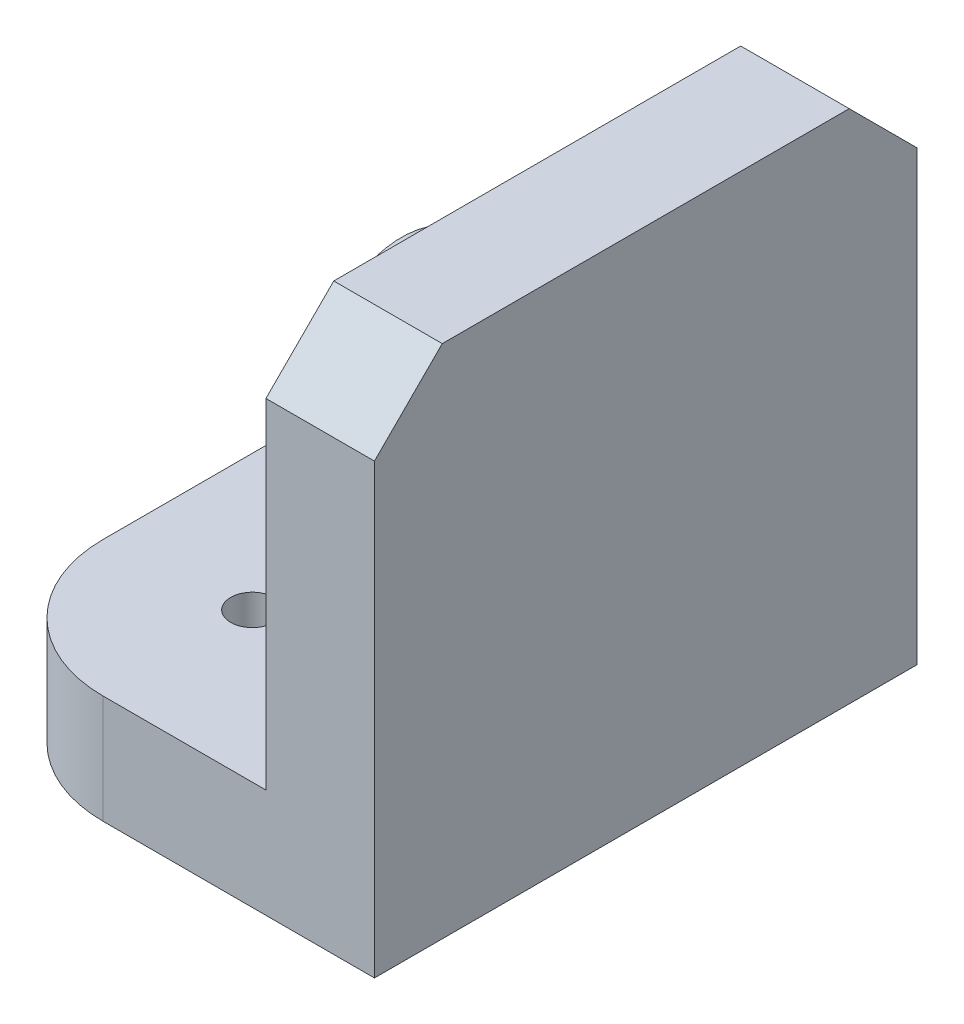
ISO-10303-21;
HEADER;
FILE_DESCRIPTION(('STEP AP214'),'2;1');
FILE_NAME('part.step','',(''),(''),'','','');
FILE_SCHEMA(('AUTOMOTIVE_DESIGN { 1 0 10303 214 1 1 1 1 }'));
ENDSEC;
DATA;
#1=APPLICATION_CONTEXT('core data for automotive mechanical design processes');
#2=APPLICATION_PROTOCOL_DEFINITION('international standard','automotive_design',2000,#1);
#3=PRODUCT_CONTEXT('',#1,'mechanical');
#4=PRODUCT('Part','Part','',(#3));
#5=PRODUCT_RELATED_PRODUCT_CATEGORY('part','',(#4));
#6=PRODUCT_DEFINITION_FORMATION('','',#4);
#7=PRODUCT_DEFINITION_CONTEXT('part definition',#1,'design');
#8=PRODUCT_DEFINITION('design','',#6,#7);
#9=PRODUCT_DEFINITION_SHAPE('','',#8);
#10=(LENGTH_UNIT() NAMED_UNIT(*) SI_UNIT(.MILLI.,.METRE.));
#11=(NAMED_UNIT(*) PLANE_ANGLE_UNIT() SI_UNIT($,.RADIAN.));
#12=(NAMED_UNIT(*) SI_UNIT($,.STERADIAN.) SOLID_ANGLE_UNIT());
#13=UNCERTAINTY_MEASURE_WITH_UNIT(LENGTH_MEASURE(1.E-05),#10,'distance_accuracy_value','');
#14=(GEOMETRIC_REPRESENTATION_CONTEXT(3) GLOBAL_UNCERTAINTY_ASSIGNED_CONTEXT((#13)) GLOBAL_UNIT_ASSIGNED_CONTEXT((#10,
#11,#12)) REPRESENTATION_CONTEXT('',''));
#15=CARTESIAN_POINT('',(0.,0.,0.));
#16=DIRECTION('',(0.,0.,1.));
#17=DIRECTION('',(1.,0.,0.));
#18=AXIS2_PLACEMENT_3D('',#15,#16,#17);
#19=CARTESIAN_POINT('',(0.,-3.99999999999525,20.));
#20=DIRECTION('',(0.,-1.,0.));
#21=DIRECTION('',(1.,0.,0.));
#22=AXIS2_PLACEMENT_3D('',#19,#20,#21);
#23=PLANE('',#22);
#24=CARTESIAN_POINT('',(-16.,-3.99999999999527,8.99999999999999));
#25=DIRECTION('',(0.,-1.,0.));
#26=DIRECTION('',(1.,0.,0.));
#27=AXIS2_PLACEMENT_3D('',#24,#25,#26);
#28=CIRCLE('',#27,1.6);
#29=CARTESIAN_POINT('',(-14.4,-3.99999999999527,8.99999999999999));
#30=VERTEX_POINT('',#29);
#31=EDGE_CURVE('E199',#30,#30,#28,.T.);
#32=ORIENTED_EDGE('',*,*,#31,.F.);
#33=EDGE_LOOP('',(#32));
#34=FACE_BOUND('',#33,.T.);
#35=CARTESIAN_POINT('',(-16.,-3.99999999999527,-8.99999999999999));
#36=DIRECTION('',(0.,-1.,0.));
#37=DIRECTION('',(-1.,0.,0.));
#38=AXIS2_PLACEMENT_3D('',#35,#36,#37);
#39=CIRCLE('',#38,1.6);
#40=CARTESIAN_POINT('',(-17.6,-3.99999999999527,-8.99999999999999));
#41=VERTEX_POINT('',#40);
#42=EDGE_CURVE('E204',#41,#41,#39,.T.);
#43=ORIENTED_EDGE('',*,*,#42,.F.);
#44=EDGE_LOOP('',(#43));
#45=FACE_BOUND('',#44,.T.);
#46=DIRECTION('',(0.,0.,-1.));
#47=VECTOR('',#46,1.);
#48=CARTESIAN_POINT('',(-26.,-3.99999999999529,20.));
#49=LINE('',#48,#47);
#50=CARTESIAN_POINT('',(-26.,-3.99999999999529,10.));
#51=VERTEX_POINT('',#50);
#52=CARTESIAN_POINT('',(-26.,-3.99999999999529,-10.));
#53=VERTEX_POINT('',#52);
#54=EDGE_CURVE('E151',#51,#53,#49,.T.);
#55=ORIENTED_EDGE('',*,*,#54,.T.);
#56=CARTESIAN_POINT('',(-16.,-3.99999999999527,-10.));
#57=DIRECTION('',(0.,-1.,0.));
#58=DIRECTION('',(1.,0.,0.));
#59=AXIS2_PLACEMENT_3D('',#56,#57,#58);
#60=CIRCLE('',#59,10.);
#61=CARTESIAN_POINT('',(-16.,-3.99999999999527,-20.));
#62=VERTEX_POINT('',#61);
#63=EDGE_CURVE('E193',#53,#62,#60,.T.);
#64=ORIENTED_EDGE('',*,*,#63,.T.);
#65=DIRECTION('',(-1.,0.,0.));
#66=VECTOR('',#65,1.);
#67=CARTESIAN_POINT('',(0.,-3.99999999999525,-20.));
#68=LINE('',#67,#66);
#69=CARTESIAN_POINT('',(4.,-3.99999999999524,-20.));
#70=VERTEX_POINT('',#69);
#71=EDGE_CURVE('E121',#70,#62,#68,.T.);
#72=ORIENTED_EDGE('',*,*,#71,.F.);
#73=DIRECTION('',(0.,0.,-1.));
#74=VECTOR('',#73,1.);
#75=CARTESIAN_POINT('',(4.,-3.99999999999524,20.));
#76=LINE('',#75,#74);
#77=CARTESIAN_POINT('',(4.,-3.99999999999524,20.));
#78=VERTEX_POINT('',#77);
#79=EDGE_CURVE('E116',#78,#70,#76,.T.);
#80=ORIENTED_EDGE('',*,*,#79,.F.);
#81=DIRECTION('',(-1.,0.,0.));
#82=VECTOR('',#81,1.);
#83=CARTESIAN_POINT('',(0.,-3.99999999999525,20.));
#84=LINE('',#83,#82);
#85=CARTESIAN_POINT('',(-16.,-3.99999999999527,20.));
#86=VERTEX_POINT('',#85);
#87=EDGE_CURVE('E120',#78,#86,#84,.T.);
#88=ORIENTED_EDGE('',*,*,#87,.T.);
#89=CARTESIAN_POINT('',(-16.,-3.99999999999527,10.));
#90=DIRECTION('',(0.,-1.,0.));
#91=DIRECTION('',(1.,0.,0.));
#92=AXIS2_PLACEMENT_3D('',#89,#90,#91);
#93=CIRCLE('',#92,10.);
#94=EDGE_CURVE('E191',#86,#51,#93,.T.);
#95=ORIENTED_EDGE('',*,*,#94,.T.);
#96=EDGE_LOOP('',(#55,#64,#72,#80,#88,#95));
#97=FACE_BOUND('',#96,.T.);
#98=ADVANCED_FACE('F35',(#34,#45,#97),#23,.T.);
#99=CARTESIAN_POINT('',(4.00000000000001,0.,20.));
#100=DIRECTION('',(-1.,0.,0.));
#101=DIRECTION('',(0.,-1.,0.));
#102=AXIS2_PLACEMENT_3D('',#99,#100,#101);
#103=PLANE('',#102);
#104=DIRECTION('',(0.,1.,0.));
#105=VECTOR('',#104,1.);
#106=CARTESIAN_POINT('',(4.00000000000001,0.,-20.));
#107=LINE('',#106,#105);
#108=CARTESIAN_POINT('',(4.,29.0000000000022,-20.));
#109=VERTEX_POINT('',#108);
#110=EDGE_CURVE('E153',#70,#109,#107,.T.);
#111=ORIENTED_EDGE('',*,*,#110,.T.);
#112=DIRECTION('',(0.,0.707106781186546,0.707106781186549));
#113=VECTOR('',#112,1.);
#114=CARTESIAN_POINT('',(4.,29.0000000000022,-20.));
#115=LINE('',#114,#113);
#116=CARTESIAN_POINT('',(4.,34.0000000000022,-15.));
#117=VERTEX_POINT('',#116);
#118=EDGE_CURVE('E173',#109,#117,#115,.T.);
#119=ORIENTED_EDGE('',*,*,#118,.T.);
#120=DIRECTION('',(0.,0.,-1.));
#121=VECTOR('',#120,1.);
#122=CARTESIAN_POINT('',(4.,34.0000000000022,20.));
#123=LINE('',#122,#121);
#124=CARTESIAN_POINT('',(4.,34.0000000000022,15.));
#125=VERTEX_POINT('',#124);
#126=EDGE_CURVE('E126',#125,#117,#123,.T.);
#127=ORIENTED_EDGE('',*,*,#126,.F.);
#128=DIRECTION('',(0.,0.707106781186549,-0.707106781186546));
#129=VECTOR('',#128,1.);
#130=CARTESIAN_POINT('',(4.,34.0000000000022,15.));
#131=LINE('',#130,#129);
#132=CARTESIAN_POINT('',(4.,29.0000000000022,20.));
#133=VERTEX_POINT('',#132);
#134=EDGE_CURVE('E132',#125,#133,#131,.F.);
#135=ORIENTED_EDGE('',*,*,#134,.T.);
#136=DIRECTION('',(0.,1.,0.));
#137=VECTOR('',#136,1.);
#138=CARTESIAN_POINT('',(4.00000000000001,0.,20.));
#139=LINE('',#138,#137);
#140=EDGE_CURVE('E129',#78,#133,#139,.T.);
#141=ORIENTED_EDGE('',*,*,#140,.F.);
#142=ORIENTED_EDGE('',*,*,#79,.T.);
#143=EDGE_LOOP('',(#111,#119,#127,#135,#141,#142));
#144=FACE_BOUND('',#143,.T.);
#145=ADVANCED_FACE('F130',(#144),#103,.F.);
#146=CARTESIAN_POINT('',(0.,34.0000000000022,20.));
#147=DIRECTION('',(0.,1.,0.));
#148=DIRECTION('',(0.,0.,1.));
#149=AXIS2_PLACEMENT_3D('',#146,#147,#148);
#150=PLANE('',#149);
#151=ORIENTED_EDGE('',*,*,#126,.T.);
#152=DIRECTION('',(-1.,0.,0.));
#153=VECTOR('',#152,1.);
#154=CARTESIAN_POINT('',(-4.,34.0000000000022,-15.));
#155=LINE('',#154,#153);
#156=CARTESIAN_POINT('',(-4.,34.0000000000022,-15.));
#157=VERTEX_POINT('',#156);
#158=EDGE_CURVE('E178',#117,#157,#155,.T.);
#159=ORIENTED_EDGE('',*,*,#158,.T.);
#160=DIRECTION('',(0.,0.,-1.));
#161=VECTOR('',#160,1.);
#162=CARTESIAN_POINT('',(-4.,34.0000000000022,20.));
#163=LINE('',#162,#161);
#164=CARTESIAN_POINT('',(-4.,34.0000000000022,15.));
#165=VERTEX_POINT('',#164);
#166=EDGE_CURVE('E165',#165,#157,#163,.T.);
#167=ORIENTED_EDGE('',*,*,#166,.F.);
#168=DIRECTION('',(1.,0.,0.));
#169=VECTOR('',#168,1.);
#170=CARTESIAN_POINT('',(0.,34.0000000000022,15.));
#171=LINE('',#170,#169);
#172=EDGE_CURVE('E175',#165,#125,#171,.T.);
#173=ORIENTED_EDGE('',*,*,#172,.T.);
#174=EDGE_LOOP('',(#151,#159,#167,#173));
#175=FACE_BOUND('',#174,.T.);
#176=ADVANCED_FACE('F222',(#175),#150,.T.);
#177=CARTESIAN_POINT('',(-4.,0.,20.));
#178=DIRECTION('',(-1.,0.,0.));
#179=DIRECTION('',(0.,0.,1.));
#180=AXIS2_PLACEMENT_3D('',#177,#178,#179);
#181=PLANE('',#180);
#182=CARTESIAN_POINT('',(-4.00000000000001,17.8500000000001,-7.19650034008978E-11));
#183=DIRECTION('',(-1.,0.,0.));
#184=DIRECTION('',(0.,-1.,0.));
#185=AXIS2_PLACEMENT_3D('',#182,#183,#184);
#186=CIRCLE('',#185,6.44000000006607);
#187=CARTESIAN_POINT('',(-4.,11.409999999934,-7.19650034008978E-11));
#188=VERTEX_POINT('',#187);
#189=EDGE_CURVE('E144',#188,#188,#186,.T.);
#190=ORIENTED_EDGE('',*,*,#189,.F.);
#191=EDGE_LOOP('',(#190));
#192=FACE_BOUND('',#191,.T.);
#193=ORIENTED_EDGE('',*,*,#166,.T.);
#194=DIRECTION('',(0.,-0.707106781186546,-0.707106781186549));
#195=VECTOR('',#194,1.);
#196=CARTESIAN_POINT('',(-4.,34.5000000000012,-14.500000000001));
#197=LINE('',#196,#195);
#198=CARTESIAN_POINT('',(-4.,29.0000000000022,-20.));
#199=VERTEX_POINT('',#198);
#200=EDGE_CURVE('E182',#157,#199,#197,.T.);
#201=ORIENTED_EDGE('',*,*,#200,.T.);
#202=DIRECTION('',(0.,1.,0.));
#203=VECTOR('',#202,1.);
#204=CARTESIAN_POINT('',(-4.,0.,-20.));
#205=LINE('',#204,#203);
#206=CARTESIAN_POINT('',(-4.,4.00000000000222,-20.));
#207=VERTEX_POINT('',#206);
#208=EDGE_CURVE('E141',#207,#199,#205,.T.);
#209=ORIENTED_EDGE('',*,*,#208,.F.);
#210=DIRECTION('',(0.,0.,-1.));
#211=VECTOR('',#210,1.);
#212=CARTESIAN_POINT('',(-4.,4.00000000000222,20.));
#213=LINE('',#212,#211);
#214=CARTESIAN_POINT('',(-4.,4.00000000000222,20.));
#215=VERTEX_POINT('',#214);
#216=EDGE_CURVE('E162',#215,#207,#213,.T.);
#217=ORIENTED_EDGE('',*,*,#216,.F.);
#218=DIRECTION('',(0.,1.,0.));
#219=VECTOR('',#218,1.);
#220=CARTESIAN_POINT('',(-4.,0.,20.));
#221=LINE('',#220,#219);
#222=CARTESIAN_POINT('',(-4.,29.0000000000022,20.));
#223=VERTEX_POINT('',#222);
#224=EDGE_CURVE('E135',#215,#223,#221,.T.);
#225=ORIENTED_EDGE('',*,*,#224,.T.);
#226=DIRECTION('',(0.,-0.707106781186549,0.707106781186546));
#227=VECTOR('',#226,1.);
#228=CARTESIAN_POINT('',(-4.,14.500000000001,34.5000000000011));
#229=LINE('',#228,#227);
#230=EDGE_CURVE('E180',#223,#165,#229,.F.);
#231=ORIENTED_EDGE('',*,*,#230,.T.);
#232=EDGE_LOOP('',(#193,#201,#209,#217,#225,#231));
#233=FACE_BOUND('',#232,.T.);
#234=ADVANCED_FACE('F218',(#192,#233),#181,.T.);
#235=CARTESIAN_POINT('',(0.,4.00000000000222,20.));
#236=DIRECTION('',(0.,1.,0.));
#237=DIRECTION('',(-1.,0.,0.));
#238=AXIS2_PLACEMENT_3D('',#235,#236,#237);
#239=PLANE('',#238);
#240=CARTESIAN_POINT('',(-16.,4.00000000000222,8.99999999999999));
#241=DIRECTION('',(0.,1.,0.));
#242=DIRECTION('',(-1.,0.,0.));
#243=AXIS2_PLACEMENT_3D('',#240,#241,#242);
#244=CIRCLE('',#243,1.6);
#245=CARTESIAN_POINT('',(-17.6,4.00000000000222,8.99999999999999));
#246=VERTEX_POINT('',#245);
#247=EDGE_CURVE('E39',#246,#246,#244,.T.);
#248=ORIENTED_EDGE('',*,*,#247,.F.);
#249=EDGE_LOOP('',(#248));
#250=FACE_BOUND('',#249,.T.);
#251=CARTESIAN_POINT('',(-16.,4.00000000000222,-8.99999999999999));
#252=DIRECTION('',(0.,1.,0.));
#253=DIRECTION('',(-1.,0.,0.));
#254=AXIS2_PLACEMENT_3D('',#251,#252,#253);
#255=CIRCLE('',#254,1.6);
#256=CARTESIAN_POINT('',(-17.6,4.00000000000222,-8.99999999999999));
#257=VERTEX_POINT('',#256);
#258=EDGE_CURVE('E197',#257,#257,#255,.T.);
#259=ORIENTED_EDGE('',*,*,#258,.F.);
#260=EDGE_LOOP('',(#259));
#261=FACE_BOUND('',#260,.T.);
#262=DIRECTION('',(1.,0.,0.));
#263=VECTOR('',#262,1.);
#264=CARTESIAN_POINT('',(0.,4.00000000000222,-20.));
#265=LINE('',#264,#263);
#266=CARTESIAN_POINT('',(-16.,4.00000000000222,-20.));
#267=VERTEX_POINT('',#266);
#268=EDGE_CURVE('E139',#267,#207,#265,.T.);
#269=ORIENTED_EDGE('',*,*,#268,.F.);
#270=CARTESIAN_POINT('',(-16.,4.00000000000222,-10.));
#271=DIRECTION('',(0.,1.,0.));
#272=DIRECTION('',(-1.,0.,0.));
#273=AXIS2_PLACEMENT_3D('',#270,#271,#272);
#274=CIRCLE('',#273,10.);
#275=CARTESIAN_POINT('',(-26.,4.00000000000222,-10.));
#276=VERTEX_POINT('',#275);
#277=EDGE_CURVE('E44',#267,#276,#274,.T.);
#278=ORIENTED_EDGE('',*,*,#277,.T.);
#279=DIRECTION('',(0.,0.,-1.));
#280=VECTOR('',#279,1.);
#281=CARTESIAN_POINT('',(-26.,4.00000000000222,20.));
#282=LINE('',#281,#280);
#283=CARTESIAN_POINT('',(-26.,4.00000000000222,10.));
#284=VERTEX_POINT('',#283);
#285=EDGE_CURVE('E159',#284,#276,#282,.T.);
#286=ORIENTED_EDGE('',*,*,#285,.F.);
#287=CARTESIAN_POINT('',(-16.,4.00000000000222,10.));
#288=DIRECTION('',(0.,1.,0.));
#289=DIRECTION('',(-1.,0.,0.));
#290=AXIS2_PLACEMENT_3D('',#287,#288,#289);
#291=CIRCLE('',#290,10.);
#292=CARTESIAN_POINT('',(-16.,4.00000000000222,20.));
#293=VERTEX_POINT('',#292);
#294=EDGE_CURVE('E52',#284,#293,#291,.T.);
#295=ORIENTED_EDGE('',*,*,#294,.T.);
#296=DIRECTION('',(1.,0.,0.));
#297=VECTOR('',#296,1.);
#298=CARTESIAN_POINT('',(0.,4.00000000000222,20.));
#299=LINE('',#298,#297);
#300=EDGE_CURVE('E149',#293,#215,#299,.T.);
#301=ORIENTED_EDGE('',*,*,#300,.T.);
#302=ORIENTED_EDGE('',*,*,#216,.T.);
#303=EDGE_LOOP('',(#269,#278,#286,#295,#301,#302));
#304=FACE_BOUND('',#303,.T.);
#305=ADVANCED_FACE('F221',(#250,#261,#304),#239,.T.);
#306=CARTESIAN_POINT('',(-26.,0.,20.));
#307=DIRECTION('',(1.,0.,0.));
#308=DIRECTION('',(0.,0.,-1.));
#309=AXIS2_PLACEMENT_3D('',#306,#307,#308);
#310=PLANE('',#309);
#311=ORIENTED_EDGE('',*,*,#285,.T.);
#312=DIRECTION('',(0.,-1.,0.));
#313=VECTOR('',#312,1.);
#314=CARTESIAN_POINT('',(-26.,0.,-10.));
#315=LINE('',#314,#313);
#316=EDGE_CURVE('E188',#276,#53,#315,.T.);
#317=ORIENTED_EDGE('',*,*,#316,.T.);
#318=ORIENTED_EDGE('',*,*,#54,.F.);
#319=DIRECTION('',(0.,-1.,0.));
#320=VECTOR('',#319,1.);
#321=CARTESIAN_POINT('',(-26.,4.00000000000222,10.));
#322=LINE('',#321,#320);
#323=EDGE_CURVE('E186',#51,#284,#322,.F.);
#324=ORIENTED_EDGE('',*,*,#323,.T.);
#325=EDGE_LOOP('',(#311,#317,#318,#324));
#326=FACE_BOUND('',#325,.T.);
#327=ADVANCED_FACE('F244',(#326),#310,.F.);
#328=CARTESIAN_POINT('',(0.,0.,20.));
#329=DIRECTION('',(0.,0.,1.));
#330=DIRECTION('',(1.,0.,0.));
#331=AXIS2_PLACEMENT_3D('',#328,#329,#330);
#332=PLANE('',#331);
#333=ORIENTED_EDGE('',*,*,#300,.F.);
#334=DIRECTION('',(0.,-1.,0.));
#335=VECTOR('',#334,1.);
#336=CARTESIAN_POINT('',(-16.,-3.99999999999529,20.));
#337=LINE('',#336,#335);
#338=EDGE_CURVE('E11',#293,#86,#337,.T.);
#339=ORIENTED_EDGE('',*,*,#338,.T.);
#340=ORIENTED_EDGE('',*,*,#87,.F.);
#341=ORIENTED_EDGE('',*,*,#140,.T.);
#342=DIRECTION('',(-1.,0.,0.));
#343=VECTOR('',#342,1.);
#344=CARTESIAN_POINT('',(0.,29.0000000000022,20.));
#345=LINE('',#344,#343);
#346=EDGE_CURVE('E184',#133,#223,#345,.T.);
#347=ORIENTED_EDGE('',*,*,#346,.T.);
#348=ORIENTED_EDGE('',*,*,#224,.F.);
#349=EDGE_LOOP('',(#333,#339,#340,#341,#347,#348));
#350=FACE_BOUND('',#349,.T.);
#351=ADVANCED_FACE('F137',(#350),#332,.T.);
#352=CARTESIAN_POINT('',(0.,0.,-20.));
#353=DIRECTION('',(0.,0.,1.));
#354=DIRECTION('',(1.,0.,0.));
#355=AXIS2_PLACEMENT_3D('',#352,#353,#354);
#356=PLANE('',#355);
#357=ORIENTED_EDGE('',*,*,#71,.T.);
#358=DIRECTION('',(0.,-1.,0.));
#359=VECTOR('',#358,1.);
#360=CARTESIAN_POINT('',(-16.,0.,-20.));
#361=LINE('',#360,#359);
#362=EDGE_CURVE('E60',#62,#267,#361,.F.);
#363=ORIENTED_EDGE('',*,*,#362,.T.);
#364=ORIENTED_EDGE('',*,*,#268,.T.);
#365=ORIENTED_EDGE('',*,*,#208,.T.);
#366=DIRECTION('',(1.,0.,0.));
#367=VECTOR('',#366,1.);
#368=CARTESIAN_POINT('',(4.,29.0000000000022,-20.));
#369=LINE('',#368,#367);
#370=EDGE_CURVE('E125',#199,#109,#369,.T.);
#371=ORIENTED_EDGE('',*,*,#370,.T.);
#372=ORIENTED_EDGE('',*,*,#110,.F.);
#373=EDGE_LOOP('',(#357,#363,#364,#365,#371,#372));
#374=FACE_BOUND('',#373,.T.);
#375=ADVANCED_FACE('F234',(#374),#356,.F.);
#376=CARTESIAN_POINT('',(-14.,17.8500000000001,-7.19650034008978E-11));
#377=DIRECTION('',(1.,0.,0.));
#378=DIRECTION('',(0.,1.,0.));
#379=AXIS2_PLACEMENT_3D('',#376,#377,#378);
#380=CYLINDRICAL_SURFACE('',#379,6.44000000006607);
#381=CARTESIAN_POINT('',(-14.,17.8500000000001,-7.19650034008978E-11));
#382=DIRECTION('',(-1.,0.,0.));
#383=DIRECTION('',(0.,-1.,0.));
#384=AXIS2_PLACEMENT_3D('',#381,#382,#383);
#385=CIRCLE('',#384,6.44000000006607);
#386=CARTESIAN_POINT('',(-14.,11.409999999934,-7.19650034008978E-11));
#387=VERTEX_POINT('',#386);
#388=EDGE_CURVE('E154',#387,#387,#385,.T.);
#389=ORIENTED_EDGE('',*,*,#388,.F.);
#390=EDGE_LOOP('',(#389));
#391=FACE_BOUND('',#390,.T.);
#392=ORIENTED_EDGE('',*,*,#189,.T.);
#393=EDGE_LOOP('',(#392));
#394=FACE_BOUND('',#393,.T.);
#395=ADVANCED_FACE('F216',(#391,#394),#380,.T.);
#396=CARTESIAN_POINT('',(-14.,17.8500000000001,-7.19650034008978E-11));
#397=DIRECTION('',(-1.,0.,0.));
#398=DIRECTION('',(0.,-1.,0.));
#399=AXIS2_PLACEMENT_3D('',#396,#397,#398);
#400=PLANE('',#399);
#401=ORIENTED_EDGE('',*,*,#388,.T.);
#402=EDGE_LOOP('',(#401));
#403=FACE_BOUND('',#402,.T.);
#404=ADVANCED_FACE('F268',(#403),#400,.T.);
#405=CARTESIAN_POINT('',(0.,29.0000000000022,-20.));
#406=DIRECTION('',(0.,0.707106781186549,-0.707106781186546));
#407=DIRECTION('',(-1.,0.,0.));
#408=AXIS2_PLACEMENT_3D('',#405,#406,#407);
#409=PLANE('',#408);
#410=ORIENTED_EDGE('',*,*,#200,.F.);
#411=ORIENTED_EDGE('',*,*,#158,.F.);
#412=ORIENTED_EDGE('',*,*,#118,.F.);
#413=ORIENTED_EDGE('',*,*,#370,.F.);
#414=EDGE_LOOP('',(#410,#411,#412,#413));
#415=FACE_BOUND('',#414,.T.);
#416=ADVANCED_FACE('F233',(#415),#409,.T.);
#417=CARTESIAN_POINT('',(0.,34.0000000000022,15.));
#418=DIRECTION('',(0.,-0.707106781186546,-0.707106781186549));
#419=DIRECTION('',(1.,0.,0.));
#420=AXIS2_PLACEMENT_3D('',#417,#418,#419);
#421=PLANE('',#420);
#422=ORIENTED_EDGE('',*,*,#230,.F.);
#423=ORIENTED_EDGE('',*,*,#346,.F.);
#424=ORIENTED_EDGE('',*,*,#134,.F.);
#425=ORIENTED_EDGE('',*,*,#172,.F.);
#426=EDGE_LOOP('',(#422,#423,#424,#425));
#427=FACE_BOUND('',#426,.T.);
#428=ADVANCED_FACE('F236',(#427),#421,.F.);
#429=CARTESIAN_POINT('',(-16.,0.,-10.));
#430=DIRECTION('',(0.,-1.,0.));
#431=DIRECTION('',(0.,0.,-1.));
#432=AXIS2_PLACEMENT_3D('',#429,#430,#431);
#433=CYLINDRICAL_SURFACE('',#432,10.);
#434=ORIENTED_EDGE('',*,*,#277,.F.);
#435=ORIENTED_EDGE('',*,*,#362,.F.);
#436=ORIENTED_EDGE('',*,*,#63,.F.);
#437=ORIENTED_EDGE('',*,*,#316,.F.);
#438=EDGE_LOOP('',(#434,#435,#436,#437));
#439=FACE_BOUND('',#438,.T.);
#440=ADVANCED_FACE('F247',(#439),#433,.T.);
#441=CARTESIAN_POINT('',(-16.,0.,10.));
#442=DIRECTION('',(0.,1.,0.));
#443=DIRECTION('',(0.,0.,1.));
#444=AXIS2_PLACEMENT_3D('',#441,#442,#443);
#445=CYLINDRICAL_SURFACE('',#444,10.);
#446=ORIENTED_EDGE('',*,*,#294,.F.);
#447=ORIENTED_EDGE('',*,*,#323,.F.);
#448=ORIENTED_EDGE('',*,*,#94,.F.);
#449=ORIENTED_EDGE('',*,*,#338,.F.);
#450=EDGE_LOOP('',(#446,#447,#448,#449));
#451=FACE_BOUND('',#450,.T.);
#452=ADVANCED_FACE('F37',(#451),#445,.T.);
#453=CARTESIAN_POINT('',(-16.,6.00000000000473,-8.99999999999999));
#454=DIRECTION('',(0.,-1.,0.));
#455=DIRECTION('',(1.,0.,0.));
#456=AXIS2_PLACEMENT_3D('',#453,#454,#455);
#457=CYLINDRICAL_SURFACE('',#456,1.6);
#458=ORIENTED_EDGE('',*,*,#258,.T.);
#459=EDGE_LOOP('',(#458));
#460=FACE_BOUND('',#459,.T.);
#461=ORIENTED_EDGE('',*,*,#42,.T.);
#462=EDGE_LOOP('',(#461));
#463=FACE_BOUND('',#462,.T.);
#464=ADVANCED_FACE('F253',(#460,#463),#457,.F.);
#465=CARTESIAN_POINT('',(-16.,6.00000000000473,8.99999999999999));
#466=DIRECTION('',(0.,-1.,0.));
#467=DIRECTION('',(1.,0.,0.));
#468=AXIS2_PLACEMENT_3D('',#465,#466,#467);
#469=CYLINDRICAL_SURFACE('',#468,1.6);
#470=ORIENTED_EDGE('',*,*,#247,.T.);
#471=EDGE_LOOP('',(#470));
#472=FACE_BOUND('',#471,.T.);
#473=ORIENTED_EDGE('',*,*,#31,.T.);
#474=EDGE_LOOP('',(#473));
#475=FACE_BOUND('',#474,.T.);
#476=ADVANCED_FACE('F337',(#472,#475),#469,.F.);
#477=CLOSED_SHELL('',(#98,#145,#176,#234,#305,#327,#351,#375,#395,#404,#416,#428,#440,#452,#464,#476));
#478=MANIFOLD_SOLID_BREP('B2',#477);
#479=ADVANCED_BREP_SHAPE_REPRESENTATION('',(#18,#478),#14);
#480=SHAPE_DEFINITION_REPRESENTATION(#9,#479);
ENDSEC;
END-ISO-10303-21;
